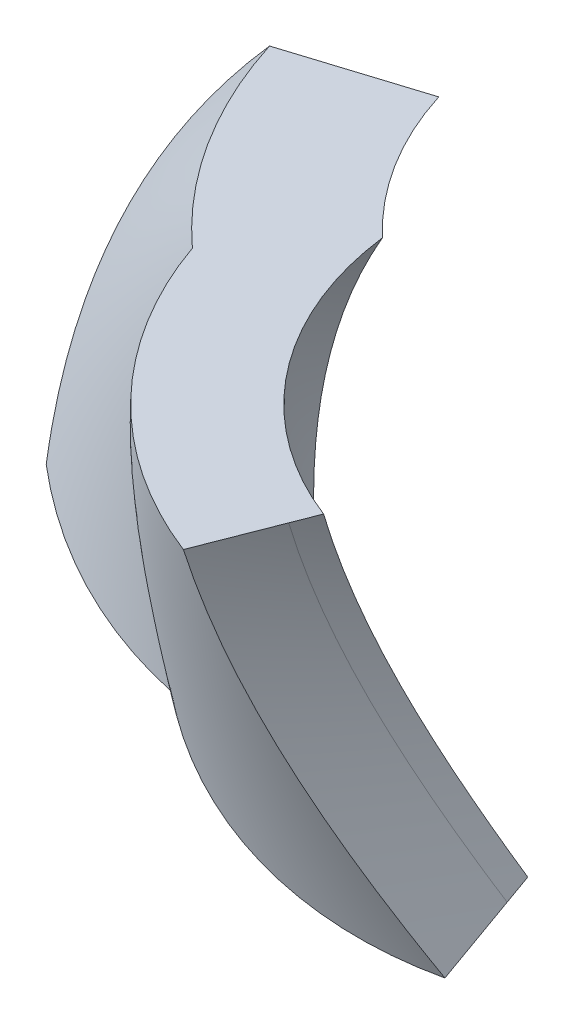
ISO-10303-21;
HEADER;
FILE_DESCRIPTION(('STEP AP214'),'2;1');
FILE_NAME('part.step','',(''),(''),'','','');
FILE_SCHEMA(('AUTOMOTIVE_DESIGN { 1 0 10303 214 1 1 1 1 }'));
ENDSEC;
DATA;
#1=APPLICATION_CONTEXT('core data for automotive mechanical design processes');
#2=APPLICATION_PROTOCOL_DEFINITION('international standard','automotive_design',2000,#1);
#3=PRODUCT_CONTEXT('',#1,'mechanical');
#4=PRODUCT('Part','Part','',(#3));
#5=PRODUCT_RELATED_PRODUCT_CATEGORY('part','',(#4));
#6=PRODUCT_DEFINITION_FORMATION('','',#4);
#7=PRODUCT_DEFINITION_CONTEXT('part definition',#1,'design');
#8=PRODUCT_DEFINITION('design','',#6,#7);
#9=PRODUCT_DEFINITION_SHAPE('','',#8);
#10=(LENGTH_UNIT() NAMED_UNIT(*) SI_UNIT(.MILLI.,.METRE.));
#11=(NAMED_UNIT(*) PLANE_ANGLE_UNIT() SI_UNIT($,.RADIAN.));
#12=(NAMED_UNIT(*) SI_UNIT($,.STERADIAN.) SOLID_ANGLE_UNIT());
#13=UNCERTAINTY_MEASURE_WITH_UNIT(LENGTH_MEASURE(1.E-05),#10,'distance_accuracy_value','');
#14=(GEOMETRIC_REPRESENTATION_CONTEXT(3) GLOBAL_UNCERTAINTY_ASSIGNED_CONTEXT((#13)) GLOBAL_UNIT_ASSIGNED_CONTEXT((#10,
#11,#12)) REPRESENTATION_CONTEXT('',''));
#15=CARTESIAN_POINT('',(0.,0.,0.));
#16=DIRECTION('',(0.,0.,1.));
#17=DIRECTION('',(1.,0.,0.));
#18=AXIS2_PLACEMENT_3D('',#15,#16,#17);
#19=CARTESIAN_POINT('',(15.,93.832,-10.));
#20=DIRECTION('',(0.,1.,0.));
#21=DIRECTION('',(0.,0.,1.));
#22=AXIS2_PLACEMENT_3D('',#19,#20,#21);
#23=PLANE('',#22);
#24=CARTESIAN_POINT('',(15.,93.832,-10.));
#25=DIRECTION('',(0.,-1.,0.));
#26=DIRECTION('',(0.,0.,1.));
#27=AXIS2_PLACEMENT_3D('',#24,#25,#26);
#28=CIRCLE('',#27,104.5);
#29=CARTESIAN_POINT('',(-56.8358537725828,93.832,65.8937422503601));
#30=VERTEX_POINT('',#29);
#31=CARTESIAN_POINT('',(-84.6707772418455,93.832,21.4004166215421));
#32=VERTEX_POINT('',#31);
#33=EDGE_CURVE('E85',#30,#32,#28,.T.);
#34=ORIENTED_EDGE('',*,*,#33,.T.);
#35=DIRECTION('',(-0.953787342027228,0.,0.30048245570854));
#36=VECTOR('',#35,1.);
#37=CARTESIAN_POINT('',(-92.3010759780632,93.832,23.8042762672104));
#38=LINE('',#37,#36);
#39=CARTESIAN_POINT('',(-92.3010759780632,93.832,23.8042762672104));
#40=VERTEX_POINT('',#39);
#41=EDGE_CURVE('E80',#32,#40,#38,.T.);
#42=ORIENTED_EDGE('',*,*,#41,.T.);
#43=DIRECTION('',(-0.953787342027229,0.,0.300482455708537));
#44=VECTOR('',#43,1.);
#45=CARTESIAN_POINT('',(-122.822270922935,93.832,33.4197148498836));
#46=LINE('',#45,#44);
#47=CARTESIAN_POINT('',(-122.822270922935,93.832,33.4197148498836));
#48=VERTEX_POINT('',#47);
#49=EDGE_CURVE('E74',#40,#48,#46,.T.);
#50=ORIENTED_EDGE('',*,*,#49,.T.);
#51=CARTESIAN_POINT('',(15.,93.832,-10.));
#52=DIRECTION('',(0.,1.,0.));
#53=DIRECTION('',(0.,0.,1.));
#54=AXIS2_PLACEMENT_3D('',#51,#52,#53);
#55=CIRCLE('',#54,144.5);
#56=CARTESIAN_POINT('',(-82.3400886223919,93.832,96.7949303430874));
#57=VERTEX_POINT('',#56);
#58=EDGE_CURVE('E115',#48,#57,#55,.T.);
#59=ORIENTED_EDGE('',*,*,#58,.T.);
#60=CARTESIAN_POINT('',(41.3342929723728,93.832,53.4084346384661));
#61=DIRECTION('',(0.,1.,0.));
#62=DIRECTION('',(0.,0.,1.));
#63=AXIS2_PLACEMENT_3D('',#60,#61,#62);
#64=CIRCLE('',#63,131.06388012101);
#65=CARTESIAN_POINT('',(-6.27577924360034,93.832,175.519129075786));
#66=VERTEX_POINT('',#65);
#67=EDGE_CURVE('E121',#57,#66,#64,.T.);
#68=ORIENTED_EDGE('',*,*,#67,.T.);
#69=DIRECTION('',(0.363258528375743,0.,-0.931688382219232));
#70=VECTOR('',#69,1.);
#71=CARTESIAN_POINT('',(2.47983221247586,93.832,153.062666706335));
#72=LINE('',#71,#70);
#73=CARTESIAN_POINT('',(2.47983221247586,93.832,153.062666706335));
#74=VERTEX_POINT('',#73);
#75=EDGE_CURVE('E132',#66,#74,#72,.T.);
#76=ORIENTED_EDGE('',*,*,#75,.T.);
#77=DIRECTION('',(0.363258528375739,0.,-0.931688382219233));
#78=VECTOR('',#77,1.);
#79=CARTESIAN_POINT('',(2.47983221247586,93.832,153.062666706335));
#80=LINE('',#79,#78);
#81=CARTESIAN_POINT('',(5.38590043948178,93.832,145.609159648582));
#82=VERTEX_POINT('',#81);
#83=EDGE_CURVE('E137',#74,#82,#80,.T.);
#84=ORIENTED_EDGE('',*,*,#83,.T.);
#85=CARTESIAN_POINT('',(41.3342929723728,93.832,53.4084346384661));
#86=DIRECTION('',(0.,-1.,0.));
#87=DIRECTION('',(0.,0.,1.));
#88=AXIS2_PLACEMENT_3D('',#85,#86,#87);
#89=CIRCLE('',#88,98.9609044930863);
#90=EDGE_CURVE('E151',#82,#30,#89,.T.);
#91=ORIENTED_EDGE('',*,*,#90,.T.);
#92=EDGE_LOOP('',(#34,#42,#50,#59,#68,#76,#84,#91));
#93=FACE_BOUND('',#92,.T.);
#94=ADVANCED_FACE('F34',(#93),#23,.T.);
#95=CARTESIAN_POINT('',(-65.0514684025323,8.29024231547923,-43.4676717528875));
#96=DIRECTION('',(0.0171112491206791,0.971089173584957,0.238102965331418));
#97=DIRECTION('',(0.531618074266164,-0.210523586578129,0.820403585199271));
#98=AXIS2_PLACEMENT_3D('',#95,#96,#97);
#99=PLANE('',#98);
#100=CARTESIAN_POINT('',(-65.0514684025323,8.29024231547923,-43.4676717528875));
#101=DIRECTION('',(-0.0171112491206791,-0.971089173584957,-0.238102965331418));
#102=DIRECTION('',(0.531618074266164,-0.210523586578129,0.820403585199271));
#103=AXIS2_PLACEMENT_3D('',#100,#101,#102);
#104=CIRCLE('',#103,104.5);
#105=CARTESIAN_POINT('',(-85.5363981585738,-15.7717103090261,56.1397581345768));
#106=VERTEX_POINT('',#105);
#107=CARTESIAN_POINT('',(-132.760782804777,-9.53740569770474,34.10728367408));
#108=VERTEX_POINT('',#107);
#109=EDGE_CURVE('E61',#106,#108,#104,.T.);
#110=ORIENTED_EDGE('',*,*,#109,.F.);
#111=CARTESIAN_POINT('',(-9.0422208366857,-2.09502240693861,-5.13706996517219));
#112=DIRECTION('',(-0.0171112491206791,-0.971089173584957,-0.238102965331418));
#113=DIRECTION('',(0.531618074266164,-0.210523586578129,0.820403585199271));
#114=AXIS2_PLACEMENT_3D('',#111,#112,#113);
#115=CIRCLE('',#114,98.9609044930863);
#116=CARTESIAN_POINT('',(9.53184495441066,-25.5511432806916,89.1925388097701));
#117=VERTEX_POINT('',#116);
#118=EDGE_CURVE('E158',#117,#106,#115,.T.);
#119=ORIENTED_EDGE('',*,*,#118,.F.);
#120=DIRECTION('',(-0.187690946098765,0.237024115673798,-0.953200753955642));
#121=VECTOR('',#120,1.);
#122=CARTESIAN_POINT('',(11.0333725232008,-27.4473362060819,96.8181448414152));
#123=LINE('',#122,#121);
#124=CARTESIAN_POINT('',(11.0333725232008,-27.4473362060819,96.8181448414152));
#125=VERTEX_POINT('',#124);
#126=EDGE_CURVE('E145',#125,#117,#123,.T.);
#127=ORIENTED_EDGE('',*,*,#126,.F.);
#128=DIRECTION('',(-0.18769094609876,0.237024115673798,-0.953200753955643));
#129=VECTOR('',#128,1.);
#130=CARTESIAN_POINT('',(11.0333725232008,-27.4473362060819,96.8181448414152));
#131=LINE('',#130,#129);
#132=CARTESIAN_POINT('',(15.5572828226012,-33.1603226893978,119.793119382527));
#133=VERTEX_POINT('',#132);
#134=EDGE_CURVE('E138',#133,#125,#131,.T.);
#135=ORIENTED_EDGE('',*,*,#134,.F.);
#136=CARTESIAN_POINT('',(-9.0422208366857,-2.09502240693861,-5.13706996517219));
#137=DIRECTION('',(0.0171112491206791,0.971089173584957,0.238102965331418));
#138=DIRECTION('',(0.531618074266164,-0.210523586578129,0.820403585199271));
#139=AXIS2_PLACEMENT_3D('',#136,#137,#138);
#140=CIRCLE('',#139,131.06388012101);
#141=CARTESIAN_POINT('',(-90.7060430807206,-25.1474294524787,94.7496025105691));
#142=VERTEX_POINT('',#141);
#143=EDGE_CURVE('E129',#142,#133,#140,.T.);
#144=ORIENTED_EDGE('',*,*,#143,.F.);
#145=CARTESIAN_POINT('',(-65.0514684025323,8.29024231547923,-43.4676717528875));
#146=DIRECTION('',(0.0171112491206791,0.971089173584957,0.238102965331418));
#147=DIRECTION('',(0.531618074266164,-0.210523586578129,0.820403585199271));
#148=AXIS2_PLACEMENT_3D('',#145,#146,#147);
#149=CIRCLE('',#148,144.5);
#150=CARTESIAN_POINT('',(-158.678223724297,-16.361385798445,63.8010465169384));
#151=VERTEX_POINT('',#150);
#152=EDGE_CURVE('E126',#151,#142,#149,.T.);
#153=ORIENTED_EDGE('',*,*,#152,.F.);
#154=DIRECTION('',(-0.647936022987988,-0.170599502518507,0.742344071071459));
#155=VECTOR('',#154,1.);
#156=CARTESIAN_POINT('',(-158.678223724297,-16.361385798445,63.8010465169384));
#157=LINE('',#156,#155);
#158=CARTESIAN_POINT('',(-137.944270988681,-10.9022017178528,40.0460362426516));
#159=VERTEX_POINT('',#158);
#160=EDGE_CURVE('E11',#159,#151,#157,.T.);
#161=ORIENTED_EDGE('',*,*,#160,.F.);
#162=DIRECTION('',(-0.647936022987985,-0.170599502518507,0.742344071071461));
#163=VECTOR('',#162,1.);
#164=CARTESIAN_POINT('',(-137.944270988681,-10.9022017178528,40.0460362426516));
#165=LINE('',#164,#163);
#166=EDGE_CURVE('E52',#108,#159,#165,.T.);
#167=ORIENTED_EDGE('',*,*,#166,.F.);
#168=EDGE_LOOP('',(#110,#119,#127,#135,#144,#153,#161,#167));
#169=FACE_BOUND('',#168,.T.);
#170=ADVANCED_FACE('F208',(#169),#99,.F.);
#171=CARTESIAN_POINT('',(-122.822270922935,93.832,33.4197148498836));
#172=CARTESIAN_POINT('',(-137.762277480713,76.5558308724686,36.1660899296712));
#173=CARTESIAN_POINT('',(-148.395900286006,58.7940188917679,40.2493459356514));
#174=CARTESIAN_POINT('',(-160.504475056221,22.1117036449407,50.5747677280877));
#175=CARTESIAN_POINT('',(-161.978208583081,3.19309824642362,56.8142718710368));
#176=CARTESIAN_POINT('',(-158.678223724297,-16.361385798445,63.8010465169384));
#177=CARTESIAN_POINT('',(-115.113005963531,93.832,57.8903592915869));
#178=CARTESIAN_POINT('',(-127.769370327829,75.6468656541438,59.9173004427113));
#179=CARTESIAN_POINT('',(-136.20966207883,57.0486229393265,62.9044336210159));
#180=CARTESIAN_POINT('',(-144.313573127876,18.9158493383957,70.3849927818674));
#181=CARTESIAN_POINT('',(-143.976641396349,-0.617223494571884,74.8765660540416));
#182=CARTESIAN_POINT('',(-139.140893938141,-20.6454197725067,79.8691827916481));
#183=CARTESIAN_POINT('',(-101.301761152541,93.832,79.511985557376));
#184=CARTESIAN_POINT('',(-111.940379234199,74.9030066508799,80.2500691749717));
#185=CARTESIAN_POINT('',(-118.535575276104,55.664305096269,81.6191657007307));
#186=CARTESIAN_POINT('',(-123.464104328095,16.5166516652177,85.3541069270896));
#187=CARTESIAN_POINT('',(-121.797272732063,-3.39140648209378,87.7189230411738));
#188=CARTESIAN_POINT('',(-115.950928035718,-23.6429409764038,90.427854757535));
#189=CARTESIAN_POINT('',(-82.3400886223919,93.832,96.7949303430874));
#190=CARTESIAN_POINT('',(-91.3658658619471,74.3754941777129,95.763531343169));
#191=CARTESIAN_POINT('',(-96.5913298989854,54.7364405885187,95.1041549062467));
#192=CARTESIAN_POINT('',(-99.3925326952496,15.0794079389116,94.4507844087985));
#193=CARTESIAN_POINT('',(-96.9682386198202,-4.93831796703393,94.4565214427036));
#194=CARTESIAN_POINT('',(-90.7060430807206,-25.1474294524787,94.7496025105691));
#195=(BOUNDED_SURFACE() B_SPLINE_SURFACE(3,3,((#171,#172,#173,#174,#175,#176),(#177,#178,#179,
#180,#181,#182),(#183,#184,#185,#186,#187,#188),(#189,#190,#191,#192,#193,#194)),.UNSPECIFIED.,
.F.,.F.,.F.) B_SPLINE_SURFACE_WITH_KNOTS((4,4),(4,2,4),(0.,1.),(0.,0.5,1.),
.UNSPECIFIED.) GEOMETRIC_REPRESENTATION_ITEM() RATIONAL_B_SPLINE_SURFACE(((1.,1.,1.,1.,1.,1.),
(0.977034362326999,0.977034362326999,0.977034362326999,0.977034362326999,0.977034362326999,
0.977034362326999),(0.977034362326999,0.977034362326999,0.977034362326999,0.977034362326999,
0.977034362326999,0.977034362326999),(1.,1.,1.,1.,1.,1.))) REPRESENTATION_ITEM('') SURFACE());
#196=CARTESIAN_POINT('',(-82.3400886223919,93.832,96.7949303430874));
#197=CARTESIAN_POINT('',(-91.3658658619471,74.3754941777129,95.763531343169));
#198=CARTESIAN_POINT('',(-96.5913298989854,54.7364405885187,95.1041549062467));
#199=CARTESIAN_POINT('',(-99.3925326952496,15.0794079389116,94.4507844087985));
#200=CARTESIAN_POINT('',(-96.9682386198202,-4.93831796703393,94.4565214427036));
#201=CARTESIAN_POINT('',(-90.7060430807206,-25.1474294524787,94.7496025105691));
#202=B_SPLINE_CURVE_WITH_KNOTS('',3,(#196,#197,#198,#199,#200,#201),.UNSPECIFIED.,.F.,.F.,(4,2,
4),(0.,0.5,1.),.UNSPECIFIED.);
#203=EDGE_CURVE('E118',#57,#142,#202,.T.);
#204=CARTESIAN_POINT('',(-122.822270922935,93.832,33.4197148498836));
#205=CARTESIAN_POINT('',(-137.762277480713,76.5558308724686,36.1660899296712));
#206=CARTESIAN_POINT('',(-148.395900286006,58.7940188917679,40.2493459356514));
#207=CARTESIAN_POINT('',(-160.504475056221,22.1117036449407,50.5747677280877));
#208=CARTESIAN_POINT('',(-161.978208583081,3.19309824642362,56.8142718710368));
#209=CARTESIAN_POINT('',(-158.678223724297,-16.361385798445,63.8010465169384));
#210=B_SPLINE_CURVE_WITH_KNOTS('',3,(#204,#205,#206,#207,#208,#209),.UNSPECIFIED.,.F.,.F.,(4,2,
4),(0.,0.5,1.),.UNSPECIFIED.);
#211=EDGE_CURVE('E37',#48,#151,#210,.T.);
#212=ORIENTED_EDGE('',*,*,#203,.F.);
#213=ORIENTED_EDGE('',*,*,#58,.F.);
#214=ORIENTED_EDGE('',*,*,#211,.T.);
#215=ORIENTED_EDGE('',*,*,#152,.T.);
#216=EDGE_LOOP('',(#212,#213,#214,#215));
#217=FACE_BOUND('',#216,.T.);
#218=ADVANCED_FACE('F116',(#217),#195,.F.);
#219=CARTESIAN_POINT('',(-82.3400886223919,93.832,96.7949303430874));
#220=CARTESIAN_POINT('',(-91.3658658619677,74.3754941776685,95.7635313431666));
#221=CARTESIAN_POINT('',(-96.5913298988302,54.7364405885187,95.1041549062467));
#222=CARTESIAN_POINT('',(-99.3925326954049,15.0794079389116,94.4507844087985));
#223=CARTESIAN_POINT('',(-96.9682386198061,-4.93831796707979,94.4565214417278));
#224=CARTESIAN_POINT('',(-90.7060430807206,-25.1474294524787,94.7496025105691));
#225=CARTESIAN_POINT('',(-69.4773304480991,93.832,133.460571044722));
#226=CARTESIAN_POINT('',(-75.0815187499484,73.0245316102348,131.228831643501));
#227=CARTESIAN_POINT('',(-77.0378962233213,52.1508042041058,128.805351151154));
#228=CARTESIAN_POINT('',(-73.9067278973474,10.3704496149011,123.658529574536));
#229=CARTESIAN_POINT('',(-68.8197365241863,-10.5363065466399,120.935516819767));
#230=CARTESIAN_POINT('',(-60.321596424794,-31.4188148397412,118.143509466213));
#231=CARTESIAN_POINT('',(-42.4778349186086,93.832,161.404210697866));
#232=CARTESIAN_POINT('',(-45.474364535351,72.1405075134858,156.652886373507));
#233=CARTESIAN_POINT('',(-45.1675252323567,50.5680906259765,151.289204985932));
#234=CARTESIAN_POINT('',(-38.4070818787725,7.82475787880161,139.691115104564));
#235=CARTESIAN_POINT('',(-31.9542224000859,-13.3467419206302,133.457703131952));
#236=CARTESIAN_POINT('',(-22.6027738113137,-34.2630406914625,127.032860166288));
#237=CARTESIAN_POINT('',(-6.27577924360034,93.832,175.519129075786));
#238=CARTESIAN_POINT('',(-7.95512277257937,71.8850037361518,167.389408853321));
#239=CARTESIAN_POINT('',(-6.80455012627046,50.2775418986076,158.446775965154));
#240=CARTESIAN_POINT('',(0.61881954049568,7.90755972395741,139.618574472721));
#241=CARTESIAN_POINT('',(6.89100509750659,-12.8560653262486,129.734616846173));
#242=CARTESIAN_POINT('',(15.5572828226012,-33.1603226893978,119.793119382527));
#243=(BOUNDED_SURFACE() B_SPLINE_SURFACE(3,3,((#219,#220,#221,#222,#223,#224),(#225,#226,#227,
#228,#229,#230),(#231,#232,#233,#234,#235,#236),(#237,#238,#239,#240,#241,#242)),.UNSPECIFIED.,
.F.,.F.,.F.) B_SPLINE_SURFACE_WITH_KNOTS((4,4),(4,2,4),(0.,1.),(0.,0.5,1.),
.UNSPECIFIED.) GEOMETRIC_REPRESENTATION_ITEM() RATIONAL_B_SPLINE_SURFACE(((1.,1.,1.,1.,1.,1.),
(0.939083093802125,0.939083093802125,0.939083093802125,0.939083093802125,0.939083093802125,
0.939083093802125),(0.939083093802125,0.939083093802125,0.939083093802125,0.939083093802125,
0.939083093802125,0.939083093802125),(1.,1.,1.,1.,1.,1.))) REPRESENTATION_ITEM('') SURFACE());
#244=CARTESIAN_POINT('',(-6.27577924360034,93.832,175.519129075786));
#245=CARTESIAN_POINT('',(-7.95512277257937,71.8850037361518,167.389408853321));
#246=CARTESIAN_POINT('',(-6.80455012627046,50.2775418986076,158.446775965154));
#247=CARTESIAN_POINT('',(0.61881954049568,7.90755972395741,139.618574472721));
#248=CARTESIAN_POINT('',(6.89100509750659,-12.8560653262486,129.734616846173));
#249=CARTESIAN_POINT('',(15.5572828226012,-33.1603226893978,119.793119382527));
#250=B_SPLINE_CURVE_WITH_KNOTS('',3,(#244,#245,#246,#247,#248,#249),.UNSPECIFIED.,.F.,.F.,(4,2,
4),(0.,0.5,1.),.UNSPECIFIED.);
#251=EDGE_CURVE('E134',#66,#133,#250,.T.);
#252=ORIENTED_EDGE('',*,*,#251,.F.);
#253=ORIENTED_EDGE('',*,*,#67,.F.);
#254=ORIENTED_EDGE('',*,*,#203,.T.);
#255=ORIENTED_EDGE('',*,*,#143,.T.);
#256=EDGE_LOOP('',(#252,#253,#254,#255));
#257=FACE_BOUND('',#256,.T.);
#258=ADVANCED_FACE('F206',(#257),#243,.F.);
#259=CARTESIAN_POINT('',(-6.27577924360028,93.832,175.519129075786));
#260=CARTESIAN_POINT('',(-7.95512277257931,71.8850037361518,167.389408853321));
#261=CARTESIAN_POINT('',(-6.80455012627039,50.2775418986076,158.446775965154));
#262=CARTESIAN_POINT('',(0.618819540495742,7.90755972395742,139.618574472721));
#263=CARTESIAN_POINT('',(6.89100509757687,-12.8560653266571,129.734616847069));
#264=CARTESIAN_POINT('',(15.5572828226012,-33.1603226893978,119.793119382527));
#265=CARTESIAN_POINT('',(2.47983221247586,93.832,153.062666706335));
#266=CARTESIAN_POINT('',(-1.29513875287098,72.8533323712286,144.115889101873));
#267=CARTESIAN_POINT('',(-2.36750605050258,52.236313790863,134.710178978108));
#268=CARTESIAN_POINT('',(0.559775727012919,11.8005947482276,115.706423249595));
#269=CARTESIAN_POINT('',(4.55936315096955,-8.01966760971999,106.109964056949));
#270=CARTESIAN_POINT('',(11.0333725232008,-27.4473362060819,96.8181448414152));
#271=B_SPLINE_SURFACE_WITH_KNOTS('',1,3,((#259,#260,#261,#262,#263,#264),(#265,#266,#267,#268,
#269,#270)),.UNSPECIFIED.,.F.,.F.,.F.,(2,2),(4,2,4),(0.,1.),(0.,0.5,1.),.UNSPECIFIED.);
#272=CARTESIAN_POINT('',(2.47983221247586,93.832,153.062666706335));
#273=CARTESIAN_POINT('',(-1.29513875287098,72.8533323712286,144.115889101873));
#274=CARTESIAN_POINT('',(-2.36750605050258,52.236313790863,134.710178978108));
#275=CARTESIAN_POINT('',(0.559775727012919,11.8005947482276,115.706423249595));
#276=CARTESIAN_POINT('',(4.55936315096955,-8.01966760971999,106.109964056949));
#277=CARTESIAN_POINT('',(11.0333725232008,-27.4473362060819,96.8181448414152));
#278=B_SPLINE_CURVE_WITH_KNOTS('',3,(#272,#273,#274,#275,#276,#277),.UNSPECIFIED.,.F.,.F.,(4,2,
4),(0.,0.5,1.),.UNSPECIFIED.);
#279=EDGE_CURVE('E140',#74,#125,#278,.T.);
#280=ORIENTED_EDGE('',*,*,#279,.F.);
#281=ORIENTED_EDGE('',*,*,#75,.F.);
#282=ORIENTED_EDGE('',*,*,#251,.T.);
#283=ORIENTED_EDGE('',*,*,#134,.T.);
#284=EDGE_LOOP('',(#280,#281,#282,#283));
#285=FACE_BOUND('',#284,.T.);
#286=ADVANCED_FACE('F202',(#285),#271,.F.);
#287=CARTESIAN_POINT('',(2.47983221247586,93.832,153.062666706335));
#288=CARTESIAN_POINT('',(-1.29513875287098,72.8533323712286,144.115889101873));
#289=CARTESIAN_POINT('',(-2.36750605050258,52.236313790863,134.710178978108));
#290=CARTESIAN_POINT('',(0.559775727012919,11.8005947482276,115.706423249595));
#291=CARTESIAN_POINT('',(4.55936315096955,-8.01966760971999,106.109964056949));
#292=CARTESIAN_POINT('',(11.0333725232008,-27.4473362060819,96.8181448414152));
#293=CARTESIAN_POINT('',(5.38590043948178,93.832,145.609159648582));
#294=CARTESIAN_POINT('',(0.91537176230052,73.1747233999128,136.391191326389));
#295=CARTESIAN_POINT('',(-0.894810182899949,52.8864482549931,126.83178342947));
#296=CARTESIAN_POINT('',(0.540178540624666,13.092728992114,107.769759630196));
#297=CARTESIAN_POINT('',(3.78545870029907,-6.41441614043885,98.2687279727749));
#298=CARTESIAN_POINT('',(9.53184495441066,-25.5511432806916,89.1925388097701));
#299=B_SPLINE_SURFACE_WITH_KNOTS('',1,3,((#287,#288,#289,#290,#291,#292),(#293,#294,#295,#296,
#297,#298)),.UNSPECIFIED.,.F.,.F.,.F.,(2,2),(4,2,4),(0.,1.),(0.,0.5,1.),.UNSPECIFIED.);
#300=CARTESIAN_POINT('',(5.38590043948178,93.832,145.609159648582));
#301=CARTESIAN_POINT('',(0.91537176230052,73.1747233999128,136.391191326389));
#302=CARTESIAN_POINT('',(-0.894810182899949,52.8864482549931,126.83178342947));
#303=CARTESIAN_POINT('',(0.540178540624666,13.092728992114,107.769759630196));
#304=CARTESIAN_POINT('',(3.78545870029907,-6.41441614043885,98.2687279727749));
#305=CARTESIAN_POINT('',(9.53184495441066,-25.5511432806916,89.1925388097701));
#306=B_SPLINE_CURVE_WITH_KNOTS('',3,(#300,#301,#302,#303,#304,#305),.UNSPECIFIED.,.F.,.F.,(4,2,
4),(0.,0.5,1.),.UNSPECIFIED.);
#307=EDGE_CURVE('E153',#82,#117,#306,.T.);
#308=ORIENTED_EDGE('',*,*,#307,.F.);
#309=ORIENTED_EDGE('',*,*,#83,.F.);
#310=ORIENTED_EDGE('',*,*,#279,.T.);
#311=ORIENTED_EDGE('',*,*,#126,.T.);
#312=EDGE_LOOP('',(#308,#309,#310,#311));
#313=FACE_BOUND('',#312,.T.);
#314=ADVANCED_FACE('F212',(#313),#299,.F.);
#315=CARTESIAN_POINT('',(5.38590043948178,93.832,145.609159648582));
#316=CARTESIAN_POINT('',(0.91537176230052,73.1747233999128,136.391191326389));
#317=CARTESIAN_POINT('',(-0.894810182899949,52.8864482549931,126.83178342947));
#318=CARTESIAN_POINT('',(0.540178540624666,13.092728992114,107.769759630196));
#319=CARTESIAN_POINT('',(3.78545870029907,-6.41441614043885,98.2687279727749));
#320=CARTESIAN_POINT('',(9.53184495441066,-25.5511432806916,89.1925388097701));
#321=CARTESIAN_POINT('',(-29.2620272264547,93.832,132.100184485429));
#322=CARTESIAN_POINT('',(-34.9931776497506,73.4192587917838,126.115582044048));
#323=CARTESIAN_POINT('',(-37.6108905749732,53.1645239362739,119.98148178386));
#324=CARTESIAN_POINT('',(-36.8103692187421,13.0134817699782,107.839186145656));
#325=CARTESIAN_POINT('',(-33.3921144883066,-6.88395334781747,101.832045320324));
#326=CARTESIAN_POINT('',(-26.9900281085234,-26.6065223982326,96.12148276941));
#327=CARTESIAN_POINT('',(-52.144024776917,93.832,102.784907075804));
#328=CARTESIAN_POINT('',(-60.6108282526618,74.3927348205311,98.9356442943993));
#329=CARTESIAN_POINT('',(-65.675089507662,54.9476839796474,95.3810062483357));
#330=CARTESIAN_POINT('',(-68.9642826772474,16.0142784750525,89.0486729406475));
#331=CARTESIAN_POINT('',(-67.1888906278829,-3.47468386138142,86.2714773404651));
#332=CARTESIAN_POINT('',(-61.951294205651,-23.0101441839526,83.9663505970178));
#333=CARTESIAN_POINT('',(-56.8358537725828,93.832,65.8937422503601));
#334=CARTESIAN_POINT('',(-68.7453219548857,75.8218241403386,62.4823094659656));
#335=CARTESIAN_POINT('',(-77.2082388635526,57.735297036908,59.9370667891589));
#336=CARTESIAN_POINT('',(-86.894185341687,21.2526300060425,56.6737531932141));
#337=CARTESIAN_POINT('',(-88.1161035542751,2.85626146007715,55.9558004233593));
#338=CARTESIAN_POINT('',(-85.5363981585738,-15.7717103090261,56.1397581345768));
#339=(BOUNDED_SURFACE() B_SPLINE_SURFACE(3,3,((#315,#316,#317,#318,#319,#320),(#321,#322,#323,
#324,#325,#326),(#327,#328,#329,#330,#331,#332),(#333,#334,#335,#336,#337,#338)),.UNSPECIFIED.,
.F.,.F.,.F.) B_SPLINE_SURFACE_WITH_KNOTS((4,4),(4,2,4),(0.,1.),(0.,0.5,1.),
.UNSPECIFIED.) GEOMETRIC_REPRESENTATION_ITEM() RATIONAL_B_SPLINE_SURFACE(((1.,1.,1.,1.,1.,1.),
(0.906414953135761,0.906414953135761,0.906414953135761,0.906414953135761,0.906414953135761,
0.906414953135761),(0.906414953135761,0.906414953135761,0.906414953135761,0.906414953135761,
0.906414953135761,0.906414953135761),(1.,1.,1.,1.,1.,1.))) REPRESENTATION_ITEM('') SURFACE());
#340=CARTESIAN_POINT('',(-56.8358537725828,93.832,65.8937422503601));
#341=CARTESIAN_POINT('',(-68.7453219548857,75.8218241403386,62.4823094659656));
#342=CARTESIAN_POINT('',(-77.2082388635526,57.735297036908,59.9370667891589));
#343=CARTESIAN_POINT('',(-86.894185341687,21.2526300060425,56.6737531932141));
#344=CARTESIAN_POINT('',(-88.1161035542751,2.85626146007715,55.9558004233593));
#345=CARTESIAN_POINT('',(-85.5363981585738,-15.7717103090261,56.1397581345768));
#346=B_SPLINE_CURVE_WITH_KNOTS('',3,(#340,#341,#342,#343,#344,#345),.UNSPECIFIED.,.F.,.F.,(4,2,
4),(0.,0.5,1.),.UNSPECIFIED.);
#347=EDGE_CURVE('E164',#30,#106,#346,.T.);
#348=ORIENTED_EDGE('',*,*,#347,.F.);
#349=ORIENTED_EDGE('',*,*,#90,.F.);
#350=ORIENTED_EDGE('',*,*,#307,.T.);
#351=ORIENTED_EDGE('',*,*,#118,.T.);
#352=EDGE_LOOP('',(#348,#349,#350,#351));
#353=FACE_BOUND('',#352,.T.);
#354=ADVANCED_FACE('F215',(#353),#339,.F.);
#355=CARTESIAN_POINT('',(-56.8358537725828,93.832,65.8937422503601));
#356=CARTESIAN_POINT('',(-68.7453219548956,75.8218241403236,62.4823094659628));
#357=CARTESIAN_POINT('',(-77.2082388635526,57.735297036908,59.9370667893142));
#358=CARTESIAN_POINT('',(-86.894185341687,21.2526300060425,56.6737531930588));
#359=CARTESIAN_POINT('',(-88.1161035542743,2.85626146007135,55.9558004228711));
#360=CARTESIAN_POINT('',(-85.5363981585738,-15.7717103090261,56.1397581345768));
#361=CARTESIAN_POINT('',(-69.8184857028314,93.832,53.6052660035563));
#362=CARTESIAN_POINT('',(-82.8747172506908,76.2011271291487,51.4053579183735));
#363=CARTESIAN_POINT('',(-92.3181608016225,58.4062895982173,50.2560487276135));
#364=CARTESIAN_POINT('',(-103.542577687362,22.3048309112933,50.0249947911955));
#365=CARTESIAN_POINT('',(-105.322264391836,3.99850224467413,50.9428549027457));
#366=CARTESIAN_POINT('',(-103.063014045642,-14.6457838108526,52.8072807719443));
#367=CARTESIAN_POINT('',(-79.2993192089929,93.832,38.450425973618));
#368=CARTESIAN_POINT('',(-93.7698195879839,76.7241985315511,37.1352585012482));
#369=CARTESIAN_POINT('',(-104.509152847671,59.3810758021352,37.1015307235989));
#370=CARTESIAN_POINT('',(-117.969584082162,23.9985640956008,39.4606872657712));
#371=CARTESIAN_POINT('',(-120.689051392538,5.95993581156298,41.8526353570098));
#372=CARTESIAN_POINT('',(-119.148078147075,-12.5223217466619,45.3028153000204));
#373=CARTESIAN_POINT('',(-84.6707772418455,93.832,21.4004166215421));
#374=CARTESIAN_POINT('',(-100.732421890516,77.3575225707435,20.5865078103477));
#375=CARTESIAN_POINT('',(-112.999958060551,60.5971866971995,21.3165170585592));
#376=CARTESIAN_POINT('',(-129.250653118382,26.2252870550912,25.6578418506747));
#377=CARTESIAN_POINT('',(-133.231658603373,8.6148616443232,29.2677027097354));
#378=CARTESIAN_POINT('',(-132.760782804777,-9.53740569770474,34.10728367408));
#379=(BOUNDED_SURFACE() B_SPLINE_SURFACE(3,3,((#355,#356,#357,#358,#359,#360),(#361,#362,#363,
#364,#365,#366),(#367,#368,#369,#370,#371,#372),(#373,#374,#375,#376,#377,#378)),.UNSPECIFIED.,
.F.,.F.,.F.) B_SPLINE_SURFACE_WITH_KNOTS((4,4),(4,2,4),(0.,1.),(0.,0.5,1.),
.UNSPECIFIED.) GEOMETRIC_REPRESENTATION_ITEM() RATIONAL_B_SPLINE_SURFACE(((1.,1.,1.,1.,1.,1.),
(0.978638409487702,0.978638409487702,0.978638409487702,0.978638409487702,0.978638409487702,
0.978638409487702),(0.978638409487702,0.978638409487702,0.978638409487702,0.978638409487702,
0.978638409487702,0.978638409487702),(1.,1.,1.,1.,1.,1.))) REPRESENTATION_ITEM('') SURFACE());
#380=CARTESIAN_POINT('',(-84.6707772418455,93.832,21.4004166215421));
#381=CARTESIAN_POINT('',(-100.732421890516,77.3575225707435,20.5865078103477));
#382=CARTESIAN_POINT('',(-112.999958060551,60.5971866971995,21.3165170585592));
#383=CARTESIAN_POINT('',(-129.250653118382,26.2252870550912,25.6578418506747));
#384=CARTESIAN_POINT('',(-133.231658603373,8.6148616443232,29.2677027097354));
#385=CARTESIAN_POINT('',(-132.760782804777,-9.53740569770474,34.10728367408));
#386=B_SPLINE_CURVE_WITH_KNOTS('',3,(#380,#381,#382,#383,#384,#385),.UNSPECIFIED.,.F.,.F.,(4,2,
4),(0.,0.5,1.),.UNSPECIFIED.);
#387=EDGE_CURVE('E167',#32,#108,#386,.T.);
#388=ORIENTED_EDGE('',*,*,#387,.F.);
#389=ORIENTED_EDGE('',*,*,#33,.F.);
#390=ORIENTED_EDGE('',*,*,#347,.T.);
#391=ORIENTED_EDGE('',*,*,#109,.T.);
#392=EDGE_LOOP('',(#388,#389,#390,#391));
#393=FACE_BOUND('',#392,.T.);
#394=ADVANCED_FACE('F216',(#393),#379,.F.);
#395=CARTESIAN_POINT('',(-84.6707772418455,93.832,21.4004166215421));
#396=CARTESIAN_POINT('',(-100.732421890459,77.3575225708017,20.5865078103506));
#397=CARTESIAN_POINT('',(-112.999958060706,60.5971866971995,21.3165170585592));
#398=CARTESIAN_POINT('',(-129.250653118227,26.2252870550912,25.6578418506747));
#399=CARTESIAN_POINT('',(-133.231658603051,8.61486164428253,29.2677027095401));
#400=CARTESIAN_POINT('',(-132.760782804777,-9.53740569770474,34.10728367408));
#401=CARTESIAN_POINT('',(-92.3010759780632,93.832,23.8042762672104));
#402=CARTESIAN_POINT('',(-108.138388967398,77.1971884464769,23.7024243114268));
#403=CARTESIAN_POINT('',(-120.079146505331,60.2365531360511,25.1030828338068));
#404=CARTESIAN_POINT('',(-135.50141750626,25.4025703731232,30.641227026328));
#405=CARTESIAN_POINT('',(-138.980962861769,7.53052008290723,34.7770174026016));
#406=CARTESIAN_POINT('',(-137.944270988681,-10.9022017178528,40.0460362426516));
#407=B_SPLINE_SURFACE_WITH_KNOTS('',1,3,((#395,#396,#397,#398,#399,#400),(#401,#402,#403,#404,
#405,#406)),.UNSPECIFIED.,.F.,.F.,.F.,(2,2),(4,2,4),(0.,1.),(0.,0.5,1.),.UNSPECIFIED.);
#408=CARTESIAN_POINT('',(-92.3010759780632,93.832,23.8042762672104));
#409=CARTESIAN_POINT('',(-108.138388967398,77.1971884464769,23.7024243114268));
#410=CARTESIAN_POINT('',(-120.079146505331,60.2365531360511,25.1030828338068));
#411=CARTESIAN_POINT('',(-135.50141750626,25.4025703731232,30.641227026328));
#412=CARTESIAN_POINT('',(-138.980962861769,7.53052008290723,34.7770174026016));
#413=CARTESIAN_POINT('',(-137.944270988681,-10.9022017178528,40.0460362426516));
#414=B_SPLINE_CURVE_WITH_KNOTS('',3,(#408,#409,#410,#411,#412,#413),.UNSPECIFIED.,.F.,.F.,(4,2,
4),(0.,0.5,1.),.UNSPECIFIED.);
#415=EDGE_CURVE('E44',#40,#159,#414,.T.);
#416=ORIENTED_EDGE('',*,*,#415,.F.);
#417=ORIENTED_EDGE('',*,*,#41,.F.);
#418=ORIENTED_EDGE('',*,*,#387,.T.);
#419=ORIENTED_EDGE('',*,*,#166,.T.);
#420=EDGE_LOOP('',(#416,#417,#418,#419));
#421=FACE_BOUND('',#420,.T.);
#422=ADVANCED_FACE('F218',(#421),#407,.F.);
#423=CARTESIAN_POINT('',(-92.3010759780632,93.832,23.8042762672104));
#424=CARTESIAN_POINT('',(-108.138388967398,77.1971884464769,23.7024243114268));
#425=CARTESIAN_POINT('',(-120.079146505331,60.2365531360511,25.1030828338068));
#426=CARTESIAN_POINT('',(-135.50141750626,25.4025703731232,30.641227026328));
#427=CARTESIAN_POINT('',(-138.980962861769,7.53052008290723,34.7770174026016));
#428=CARTESIAN_POINT('',(-137.944270988681,-10.9022017178528,40.0460362426516));
#429=CARTESIAN_POINT('',(-122.822270922935,93.832,33.4197148498836));
#430=CARTESIAN_POINT('',(-137.762277480811,76.5558308723548,36.1660899296894));
#431=CARTESIAN_POINT('',(-148.395900285695,58.7940188917679,40.2493459356514));
#432=CARTESIAN_POINT('',(-160.504475056531,22.1117036449407,50.5747677280878));
#433=CARTESIAN_POINT('',(-161.978208582954,3.19309824632662,56.8142718708158));
#434=CARTESIAN_POINT('',(-158.678223724297,-16.361385798445,63.8010465169384));
#435=B_SPLINE_SURFACE_WITH_KNOTS('',1,3,((#423,#424,#425,#426,#427,#428),(#429,#430,#431,#432,
#433,#434)),.UNSPECIFIED.,.F.,.F.,.F.,(2,2),(4,2,4),(0.,1.),(0.,0.5,1.),.UNSPECIFIED.);
#436=ORIENTED_EDGE('',*,*,#160,.T.);
#437=ORIENTED_EDGE('',*,*,#211,.F.);
#438=ORIENTED_EDGE('',*,*,#49,.F.);
#439=ORIENTED_EDGE('',*,*,#415,.T.);
#440=EDGE_LOOP('',(#436,#437,#438,#439));
#441=FACE_BOUND('',#440,.T.);
#442=ADVANCED_FACE('F124',(#441),#435,.F.);
#443=CLOSED_SHELL('',(#94,#170,#218,#258,#286,#314,#354,#394,#422,#442));
#444=MANIFOLD_SOLID_BREP('B2',#443);
#445=ADVANCED_BREP_SHAPE_REPRESENTATION('',(#18,#444),#14);
#446=SHAPE_DEFINITION_REPRESENTATION(#9,#445);
ENDSEC;
END-ISO-10303-21;
